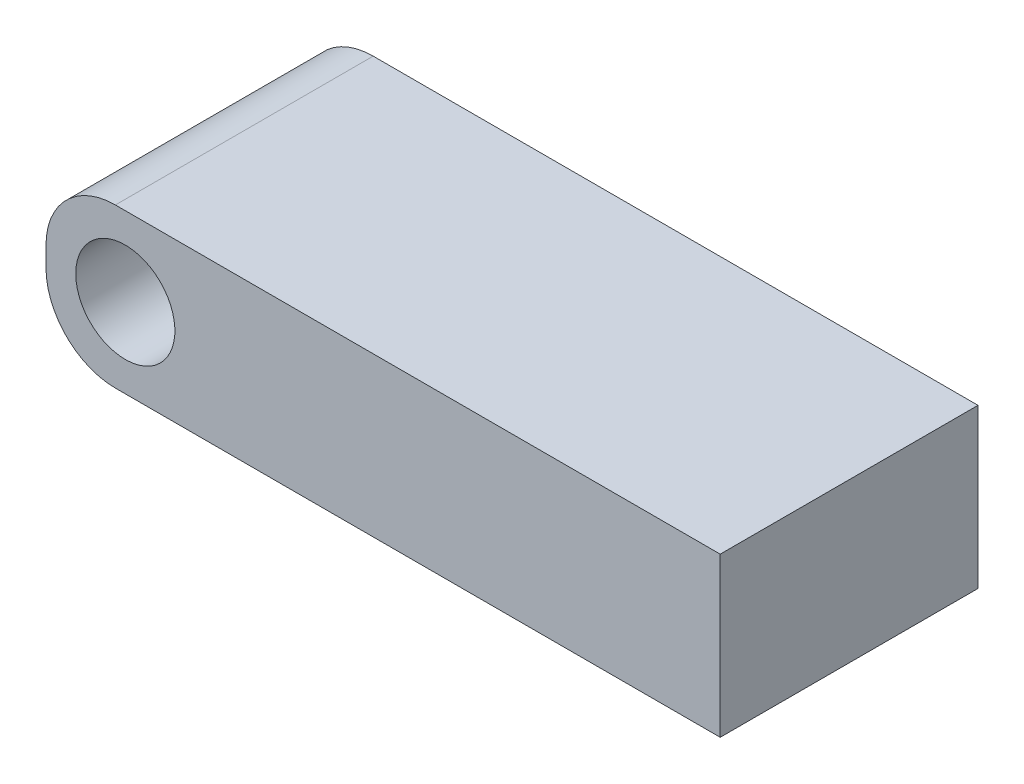
ISO-10303-21;
HEADER;
FILE_DESCRIPTION(('STEP AP214'),'2;1');
FILE_NAME('part.step','',(''),(''),'','','');
FILE_SCHEMA(('AUTOMOTIVE_DESIGN { 1 0 10303 214 1 1 1 1 }'));
ENDSEC;
DATA;
#1=APPLICATION_CONTEXT('core data for automotive mechanical design processes');
#2=APPLICATION_PROTOCOL_DEFINITION('international standard','automotive_design',2000,#1);
#3=PRODUCT_CONTEXT('',#1,'mechanical');
#4=PRODUCT('Part','Part','',(#3));
#5=PRODUCT_RELATED_PRODUCT_CATEGORY('part','',(#4));
#6=PRODUCT_DEFINITION_FORMATION('','',#4);
#7=PRODUCT_DEFINITION_CONTEXT('part definition',#1,'design');
#8=PRODUCT_DEFINITION('design','',#6,#7);
#9=PRODUCT_DEFINITION_SHAPE('','',#8);
#10=(LENGTH_UNIT() NAMED_UNIT(*) SI_UNIT(.MILLI.,.METRE.));
#11=(NAMED_UNIT(*) PLANE_ANGLE_UNIT() SI_UNIT($,.RADIAN.));
#12=(NAMED_UNIT(*) SI_UNIT($,.STERADIAN.) SOLID_ANGLE_UNIT());
#13=UNCERTAINTY_MEASURE_WITH_UNIT(LENGTH_MEASURE(1.E-05),#10,'distance_accuracy_value','');
#14=(GEOMETRIC_REPRESENTATION_CONTEXT(3) GLOBAL_UNCERTAINTY_ASSIGNED_CONTEXT((#13)) GLOBAL_UNIT_ASSIGNED_CONTEXT((#10,
#11,#12)) REPRESENTATION_CONTEXT('',''));
#15=CARTESIAN_POINT('',(0.,0.,0.));
#16=DIRECTION('',(0.,0.,1.));
#17=DIRECTION('',(1.,0.,0.));
#18=AXIS2_PLACEMENT_3D('',#15,#16,#17);
#19=CARTESIAN_POINT('',(-19.5,30.9286384577808,6.5));
#20=DIRECTION('',(0.,0.,-1.));
#21=DIRECTION('',(-1.,0.,0.));
#22=AXIS2_PLACEMENT_3D('',#19,#20,#21);
#23=PLANE('',#22);
#24=CARTESIAN_POINT('',(-19.5,30.9286384577808,6.5));
#25=DIRECTION('',(0.,0.,-1.));
#26=DIRECTION('',(-1.,0.,0.));
#27=AXIS2_PLACEMENT_3D('',#24,#25,#26);
#28=CIRCLE('',#27,3.5);
#29=CARTESIAN_POINT('',(-23.,30.9286384577807,6.5));
#30=VERTEX_POINT('',#29);
#31=CARTESIAN_POINT('',(-19.5,34.4286384577808,6.5));
#32=VERTEX_POINT('',#31);
#33=EDGE_CURVE('E165',#30,#32,#28,.T.);
#34=ORIENTED_EDGE('',*,*,#33,.F.);
#35=DIRECTION('',(0.,-1.,0.));
#36=VECTOR('',#35,1.);
#37=CARTESIAN_POINT('',(-23.,30.9286384577807,6.5));
#38=LINE('',#37,#36);
#39=CARTESIAN_POINT('',(-23.,29.9286384577808,6.5));
#40=VERTEX_POINT('',#39);
#41=EDGE_CURVE('E130',#30,#40,#38,.T.);
#42=ORIENTED_EDGE('',*,*,#41,.T.);
#43=CARTESIAN_POINT('',(-19.5,29.9286384577807,6.5));
#44=DIRECTION('',(0.,0.,1.));
#45=DIRECTION('',(1.,0.,0.));
#46=AXIS2_PLACEMENT_3D('',#43,#44,#45);
#47=CIRCLE('',#46,3.5);
#48=CARTESIAN_POINT('',(-19.5,26.4286384577808,6.5));
#49=VERTEX_POINT('',#48);
#50=EDGE_CURVE('E122',#40,#49,#47,.T.);
#51=ORIENTED_EDGE('',*,*,#50,.T.);
#52=DIRECTION('',(1.,0.,0.));
#53=VECTOR('',#52,1.);
#54=CARTESIAN_POINT('',(-19.5,26.4286384577808,6.5));
#55=LINE('',#54,#53);
#56=CARTESIAN_POINT('',(11.,26.4286384577808,6.5));
#57=VERTEX_POINT('',#56);
#58=EDGE_CURVE('E128',#49,#57,#55,.T.);
#59=ORIENTED_EDGE('',*,*,#58,.T.);
#60=DIRECTION('',(0.,-1.,0.));
#61=VECTOR('',#60,1.);
#62=CARTESIAN_POINT('',(11.,34.4286384577808,6.5));
#63=LINE('',#62,#61);
#64=CARTESIAN_POINT('',(11.,34.4286384577808,6.5));
#65=VERTEX_POINT('',#64);
#66=EDGE_CURVE('E145',#65,#57,#63,.T.);
#67=ORIENTED_EDGE('',*,*,#66,.F.);
#68=DIRECTION('',(1.,0.,0.));
#69=VECTOR('',#68,1.);
#70=CARTESIAN_POINT('',(-19.5,34.4286384577808,6.5));
#71=LINE('',#70,#69);
#72=EDGE_CURVE('E147',#32,#65,#71,.T.);
#73=ORIENTED_EDGE('',*,*,#72,.F.);
#74=EDGE_LOOP('',(#34,#42,#51,#59,#67,#73));
#75=FACE_BOUND('',#74,.T.);
#76=CARTESIAN_POINT('',(-19.,30.4286384577808,6.5));
#77=DIRECTION('',(0.,0.,1.));
#78=DIRECTION('',(1.,0.,0.));
#79=AXIS2_PLACEMENT_3D('',#76,#77,#78);
#80=CIRCLE('',#79,2.5);
#81=CARTESIAN_POINT('',(-21.5,30.4286384577808,6.5));
#82=VERTEX_POINT('',#81);
#83=EDGE_CURVE('E156',#82,#82,#80,.T.);
#84=ORIENTED_EDGE('',*,*,#83,.F.);
#85=EDGE_LOOP('',(#84));
#86=FACE_BOUND('',#85,.T.);
#87=ADVANCED_FACE('F64',(#75,#86),#23,.F.);
#88=CARTESIAN_POINT('',(-19.5,30.9286384577808,-6.5));
#89=DIRECTION('',(0.,0.,-1.));
#90=DIRECTION('',(-1.,0.,0.));
#91=AXIS2_PLACEMENT_3D('',#88,#89,#90);
#92=PLANE('',#91);
#93=CARTESIAN_POINT('',(-19.5,30.9286384577808,-6.5));
#94=DIRECTION('',(0.,0.,-1.));
#95=DIRECTION('',(-1.,0.,0.));
#96=AXIS2_PLACEMENT_3D('',#93,#94,#95);
#97=CIRCLE('',#96,3.5);
#98=CARTESIAN_POINT('',(-23.,30.9286384577807,-6.5));
#99=VERTEX_POINT('',#98);
#100=CARTESIAN_POINT('',(-19.5,34.4286384577808,-6.5));
#101=VERTEX_POINT('',#100);
#102=EDGE_CURVE('E152',#99,#101,#97,.T.);
#103=ORIENTED_EDGE('',*,*,#102,.T.);
#104=DIRECTION('',(1.,0.,0.));
#105=VECTOR('',#104,1.);
#106=CARTESIAN_POINT('',(-19.5,34.4286384577808,-6.5));
#107=LINE('',#106,#105);
#108=CARTESIAN_POINT('',(11.,34.4286384577808,-6.5));
#109=VERTEX_POINT('',#108);
#110=EDGE_CURVE('E155',#101,#109,#107,.T.);
#111=ORIENTED_EDGE('',*,*,#110,.T.);
#112=DIRECTION('',(0.,-1.,0.));
#113=VECTOR('',#112,1.);
#114=CARTESIAN_POINT('',(11.,34.4286384577808,-6.5));
#115=LINE('',#114,#113);
#116=CARTESIAN_POINT('',(11.,26.4286384577808,-6.5));
#117=VERTEX_POINT('',#116);
#118=EDGE_CURVE('E159',#109,#117,#115,.T.);
#119=ORIENTED_EDGE('',*,*,#118,.T.);
#120=DIRECTION('',(1.,0.,0.));
#121=VECTOR('',#120,1.);
#122=CARTESIAN_POINT('',(-19.5,26.4286384577808,-6.5));
#123=LINE('',#122,#121);
#124=CARTESIAN_POINT('',(-19.5,26.4286384577808,-6.5));
#125=VERTEX_POINT('',#124);
#126=EDGE_CURVE('E162',#125,#117,#123,.T.);
#127=ORIENTED_EDGE('',*,*,#126,.F.);
#128=CARTESIAN_POINT('',(-19.5,29.9286384577807,-6.5));
#129=DIRECTION('',(0.,0.,1.));
#130=DIRECTION('',(1.,0.,0.));
#131=AXIS2_PLACEMENT_3D('',#128,#129,#130);
#132=CIRCLE('',#131,3.5);
#133=CARTESIAN_POINT('',(-23.,29.9286384577808,-6.5));
#134=VERTEX_POINT('',#133);
#135=EDGE_CURVE('E137',#134,#125,#132,.T.);
#136=ORIENTED_EDGE('',*,*,#135,.F.);
#137=DIRECTION('',(0.,-1.,0.));
#138=VECTOR('',#137,1.);
#139=CARTESIAN_POINT('',(-23.,30.9286384577807,-6.5));
#140=LINE('',#139,#138);
#141=EDGE_CURVE('E104',#99,#134,#140,.T.);
#142=ORIENTED_EDGE('',*,*,#141,.F.);
#143=EDGE_LOOP('',(#103,#111,#119,#127,#136,#142));
#144=FACE_BOUND('',#143,.T.);
#145=CARTESIAN_POINT('',(-19.,30.4286384577808,-6.5));
#146=DIRECTION('',(0.,0.,1.));
#147=DIRECTION('',(1.,0.,0.));
#148=AXIS2_PLACEMENT_3D('',#145,#146,#147);
#149=CIRCLE('',#148,2.5);
#150=CARTESIAN_POINT('',(-21.5,30.4286384577808,-6.5));
#151=VERTEX_POINT('',#150);
#152=EDGE_CURVE('E178',#151,#151,#149,.T.);
#153=ORIENTED_EDGE('',*,*,#152,.T.);
#154=EDGE_LOOP('',(#153));
#155=FACE_BOUND('',#154,.T.);
#156=ADVANCED_FACE('F172',(#144,#155),#92,.T.);
#157=CARTESIAN_POINT('',(-19.5,30.9286384577808,6.5));
#158=DIRECTION('',(0.,0.,-1.));
#159=DIRECTION('',(-1.,0.,0.));
#160=AXIS2_PLACEMENT_3D('',#157,#158,#159);
#161=CYLINDRICAL_SURFACE('',#160,3.5);
#162=ORIENTED_EDGE('',*,*,#102,.F.);
#163=DIRECTION('',(0.,0.,-1.));
#164=VECTOR('',#163,1.);
#165=CARTESIAN_POINT('',(-23.,30.9286384577807,6.5));
#166=LINE('',#165,#164);
#167=EDGE_CURVE('E12',#30,#99,#166,.T.);
#168=ORIENTED_EDGE('',*,*,#167,.F.);
#169=ORIENTED_EDGE('',*,*,#33,.T.);
#170=DIRECTION('',(0.,0.,-1.));
#171=VECTOR('',#170,1.);
#172=CARTESIAN_POINT('',(-19.5,34.4286384577808,6.5));
#173=LINE('',#172,#171);
#174=EDGE_CURVE('E68',#32,#101,#173,.T.);
#175=ORIENTED_EDGE('',*,*,#174,.T.);
#176=EDGE_LOOP('',(#162,#168,#169,#175));
#177=FACE_BOUND('',#176,.T.);
#178=ADVANCED_FACE('F66',(#177),#161,.T.);
#179=CARTESIAN_POINT('',(-23.,30.9286384577807,6.5));
#180=DIRECTION('',(1.,0.,0.));
#181=DIRECTION('',(0.,0.,-1.));
#182=AXIS2_PLACEMENT_3D('',#179,#180,#181);
#183=PLANE('',#182);
#184=ORIENTED_EDGE('',*,*,#141,.T.);
#185=DIRECTION('',(0.,0.,-1.));
#186=VECTOR('',#185,1.);
#187=CARTESIAN_POINT('',(-23.,29.9286384577808,6.5));
#188=LINE('',#187,#186);
#189=EDGE_CURVE('E74',#40,#134,#188,.T.);
#190=ORIENTED_EDGE('',*,*,#189,.F.);
#191=ORIENTED_EDGE('',*,*,#41,.F.);
#192=ORIENTED_EDGE('',*,*,#167,.T.);
#193=EDGE_LOOP('',(#184,#190,#191,#192));
#194=FACE_BOUND('',#193,.T.);
#195=ADVANCED_FACE('F194',(#194),#183,.F.);
#196=CARTESIAN_POINT('',(-19.5,29.9286384577807,6.5));
#197=DIRECTION('',(0.,0.,-1.));
#198=DIRECTION('',(-1.,0.,0.));
#199=AXIS2_PLACEMENT_3D('',#196,#197,#198);
#200=CYLINDRICAL_SURFACE('',#199,3.5);
#201=ORIENTED_EDGE('',*,*,#135,.T.);
#202=DIRECTION('',(0.,0.,-1.));
#203=VECTOR('',#202,1.);
#204=CARTESIAN_POINT('',(-19.5,26.4286384577808,6.5));
#205=LINE('',#204,#203);
#206=EDGE_CURVE('E134',#49,#125,#205,.T.);
#207=ORIENTED_EDGE('',*,*,#206,.F.);
#208=ORIENTED_EDGE('',*,*,#50,.F.);
#209=ORIENTED_EDGE('',*,*,#189,.T.);
#210=EDGE_LOOP('',(#201,#207,#208,#209));
#211=FACE_BOUND('',#210,.T.);
#212=ADVANCED_FACE('F135',(#211),#200,.T.);
#213=CARTESIAN_POINT('',(-19.5,26.4286384577808,6.5));
#214=DIRECTION('',(0.,1.,0.));
#215=DIRECTION('',(0.,0.,1.));
#216=AXIS2_PLACEMENT_3D('',#213,#214,#215);
#217=PLANE('',#216);
#218=ORIENTED_EDGE('',*,*,#126,.T.);
#219=DIRECTION('',(0.,0.,-1.));
#220=VECTOR('',#219,1.);
#221=CARTESIAN_POINT('',(11.,26.4286384577808,6.5));
#222=LINE('',#221,#220);
#223=EDGE_CURVE('E141',#57,#117,#222,.T.);
#224=ORIENTED_EDGE('',*,*,#223,.F.);
#225=ORIENTED_EDGE('',*,*,#58,.F.);
#226=ORIENTED_EDGE('',*,*,#206,.T.);
#227=EDGE_LOOP('',(#218,#224,#225,#226));
#228=FACE_BOUND('',#227,.T.);
#229=ADVANCED_FACE('F143',(#228),#217,.F.);
#230=CARTESIAN_POINT('',(11.,34.4286384577808,6.5));
#231=DIRECTION('',(1.,0.,0.));
#232=DIRECTION('',(0.,1.,0.));
#233=AXIS2_PLACEMENT_3D('',#230,#231,#232);
#234=PLANE('',#233);
#235=ORIENTED_EDGE('',*,*,#118,.F.);
#236=DIRECTION('',(0.,0.,-1.));
#237=VECTOR('',#236,1.);
#238=CARTESIAN_POINT('',(11.,34.4286384577808,6.5));
#239=LINE('',#238,#237);
#240=EDGE_CURVE('E168',#65,#109,#239,.T.);
#241=ORIENTED_EDGE('',*,*,#240,.F.);
#242=ORIENTED_EDGE('',*,*,#66,.T.);
#243=ORIENTED_EDGE('',*,*,#223,.T.);
#244=EDGE_LOOP('',(#235,#241,#242,#243));
#245=FACE_BOUND('',#244,.T.);
#246=ADVANCED_FACE('F175',(#245),#234,.T.);
#247=CARTESIAN_POINT('',(-19.5,34.4286384577808,6.5));
#248=DIRECTION('',(0.,1.,0.));
#249=DIRECTION('',(0.,0.,1.));
#250=AXIS2_PLACEMENT_3D('',#247,#248,#249);
#251=PLANE('',#250);
#252=ORIENTED_EDGE('',*,*,#110,.F.);
#253=ORIENTED_EDGE('',*,*,#174,.F.);
#254=ORIENTED_EDGE('',*,*,#72,.T.);
#255=ORIENTED_EDGE('',*,*,#240,.T.);
#256=EDGE_LOOP('',(#252,#253,#254,#255));
#257=FACE_BOUND('',#256,.T.);
#258=ADVANCED_FACE('F170',(#257),#251,.T.);
#259=CARTESIAN_POINT('',(-19.,30.4286384577808,6.5));
#260=DIRECTION('',(0.,0.,-1.));
#261=DIRECTION('',(-1.,0.,0.));
#262=AXIS2_PLACEMENT_3D('',#259,#260,#261);
#263=CYLINDRICAL_SURFACE('',#262,2.5);
#264=CARTESIAN_POINT('',(-21.5,30.4286384577808,6.5));
#265=CARTESIAN_POINT('',(-21.5,30.4286384577808,6.36458333333333));
#266=CARTESIAN_POINT('',(-21.5,30.4286384577808,6.22916666666667));
#267=CARTESIAN_POINT('',(-21.5,30.4286384577808,5.95833333333333));
#268=CARTESIAN_POINT('',(-21.5,30.4286384577808,5.82291666666667));
#269=CARTESIAN_POINT('',(-21.5,30.4286384577808,5.55208333333333));
#270=CARTESIAN_POINT('',(-21.5,30.4286384577808,5.41666666666667));
#271=CARTESIAN_POINT('',(-21.5,30.4286384577808,5.14583333333333));
#272=CARTESIAN_POINT('',(-21.5,30.4286384577808,5.01041666666667));
#273=CARTESIAN_POINT('',(-21.5,30.4286384577808,4.73958333333333));
#274=CARTESIAN_POINT('',(-21.5,30.4286384577808,4.60416666666667));
#275=CARTESIAN_POINT('',(-21.5,30.4286384577808,4.33333333333333));
#276=CARTESIAN_POINT('',(-21.5,30.4286384577808,4.19791666666667));
#277=CARTESIAN_POINT('',(-21.5,30.4286384577808,3.92708333333333));
#278=CARTESIAN_POINT('',(-21.5,30.4286384577808,3.79166666666667));
#279=CARTESIAN_POINT('',(-21.5,30.4286384577808,3.52083333333333));
#280=CARTESIAN_POINT('',(-21.5,30.4286384577808,3.38541666666667));
#281=CARTESIAN_POINT('',(-21.5,30.4286384577808,3.11458333333333));
#282=CARTESIAN_POINT('',(-21.5,30.4286384577808,2.97916666666667));
#283=CARTESIAN_POINT('',(-21.5,30.4286384577808,2.70833333333333));
#284=CARTESIAN_POINT('',(-21.5,30.4286384577808,2.57291666666667));
#285=CARTESIAN_POINT('',(-21.5,30.4286384577808,2.30208333333333));
#286=CARTESIAN_POINT('',(-21.5,30.4286384577808,2.16666666666667));
#287=CARTESIAN_POINT('',(-21.5,30.4286384577808,1.89583333333333));
#288=CARTESIAN_POINT('',(-21.5,30.4286384577808,1.76041666666667));
#289=CARTESIAN_POINT('',(-21.5,30.4286384577808,1.48958333333333));
#290=CARTESIAN_POINT('',(-21.5,30.4286384577808,1.35416666666667));
#291=CARTESIAN_POINT('',(-21.5,30.4286384577808,1.08333333333333));
#292=CARTESIAN_POINT('',(-21.5,30.4286384577808,0.947916666666666));
#293=CARTESIAN_POINT('',(-21.5,30.4286384577808,0.677083333333332));
#294=CARTESIAN_POINT('',(-21.5,30.4286384577808,0.541666666666666));
#295=CARTESIAN_POINT('',(-21.5,30.4286384577808,0.270833333333333));
#296=CARTESIAN_POINT('',(-21.5,30.4286384577808,0.135416666666666));
#297=CARTESIAN_POINT('',(-21.5,30.4286384577808,-0.135416666666668));
#298=CARTESIAN_POINT('',(-21.5,30.4286384577808,-0.270833333333334));
#299=CARTESIAN_POINT('',(-21.5,30.4286384577808,-0.541666666666668));
#300=CARTESIAN_POINT('',(-21.5,30.4286384577808,-0.677083333333334));
#301=CARTESIAN_POINT('',(-21.5,30.4286384577808,-0.947916666666667));
#302=CARTESIAN_POINT('',(-21.5,30.4286384577808,-1.08333333333333));
#303=CARTESIAN_POINT('',(-21.5,30.4286384577808,-1.35416666666667));
#304=CARTESIAN_POINT('',(-21.5,30.4286384577808,-1.48958333333333));
#305=CARTESIAN_POINT('',(-21.5,30.4286384577808,-1.76041666666667));
#306=CARTESIAN_POINT('',(-21.5,30.4286384577808,-1.89583333333333));
#307=CARTESIAN_POINT('',(-21.5,30.4286384577808,-2.16666666666667));
#308=CARTESIAN_POINT('',(-21.5,30.4286384577808,-2.30208333333333));
#309=CARTESIAN_POINT('',(-21.5,30.4286384577808,-2.57291666666667));
#310=CARTESIAN_POINT('',(-21.5,30.4286384577808,-2.70833333333333));
#311=CARTESIAN_POINT('',(-21.5,30.4286384577808,-2.97916666666667));
#312=CARTESIAN_POINT('',(-21.5,30.4286384577808,-3.11458333333333));
#313=CARTESIAN_POINT('',(-21.5,30.4286384577808,-3.38541666666667));
#314=CARTESIAN_POINT('',(-21.5,30.4286384577808,-3.52083333333333));
#315=CARTESIAN_POINT('',(-21.5,30.4286384577808,-3.79166666666667));
#316=CARTESIAN_POINT('',(-21.5,30.4286384577808,-3.92708333333333));
#317=CARTESIAN_POINT('',(-21.5,30.4286384577808,-4.19791666666667));
#318=CARTESIAN_POINT('',(-21.5,30.4286384577808,-4.33333333333333));
#319=CARTESIAN_POINT('',(-21.5,30.4286384577808,-4.60416666666667));
#320=CARTESIAN_POINT('',(-21.5,30.4286384577808,-4.73958333333333));
#321=CARTESIAN_POINT('',(-21.5,30.4286384577808,-5.01041666666667));
#322=CARTESIAN_POINT('',(-21.5,30.4286384577808,-5.14583333333333));
#323=CARTESIAN_POINT('',(-21.5,30.4286384577808,-5.41666666666667));
#324=CARTESIAN_POINT('',(-21.5,30.4286384577808,-5.55208333333333));
#325=CARTESIAN_POINT('',(-21.5,30.4286384577808,-5.82291666666667));
#326=CARTESIAN_POINT('',(-21.5,30.4286384577808,-5.95833333333333));
#327=CARTESIAN_POINT('',(-21.5,30.4286384577808,-6.22916666666667));
#328=CARTESIAN_POINT('',(-21.5,30.4286384577808,-6.36458333333333));
#329=CARTESIAN_POINT('',(-21.5,30.4286384577808,-6.5));
#330=B_SPLINE_CURVE_WITH_KNOTS('',3,(#264,#265,#266,#267,#268,#269,#270,#271,#272,#273,#274,
#275,#276,#277,#278,#279,#280,#281,#282,#283,#284,#285,#286,#287,#288,#289,#290,#291,#292,#293,
#294,#295,#296,#297,#298,#299,#300,#301,#302,#303,#304,#305,#306,#307,#308,#309,#310,#311,#312,
#313,#314,#315,#316,#317,#318,#319,#320,#321,#322,#323,#324,#325,#326,#327,#328,#329),
.UNSPECIFIED.,.F.,.F.,(4,2,2,2,2,2,2,2,2,2,2,2,2,2,2,2,2,2,2,2,2,2,2,2,2,2,2,2,2,2,2,2,4),(0.,
0.40625,0.8125,1.21875,1.625,2.03125,2.4375,2.84375,3.25,3.65625,4.0625,4.46875,4.875,5.28125,
5.6875,6.09375,6.5,6.90625,7.3125,7.71875,8.125,8.53125,8.9375,9.34375,9.75,10.15625,10.5625,
10.96875,11.375,11.78125,12.1875,12.59375,13.),.UNSPECIFIED.);
#331=EDGE_CURVE('BSEAM184',#82,#151,#330,.T.);
#332=ORIENTED_EDGE('',*,*,#83,.T.);
#333=ORIENTED_EDGE('',*,*,#152,.F.);
#334=ORIENTED_EDGE('',*,*,#331,.T.);
#335=ORIENTED_EDGE('',*,*,#331,.F.);
#336=EDGE_LOOP('',(#332,#334,#333,#335));
#337=FACE_BOUND('',#336,.T.);
#338=ADVANCED_FACE('F184',(#337),#263,.F.);
#339=CLOSED_SHELL('',(#87,#156,#178,#195,#212,#229,#246,#258,#338));
#340=MANIFOLD_SOLID_BREP('B2',#339);
#341=ADVANCED_BREP_SHAPE_REPRESENTATION('',(#18,#340),#14);
#342=SHAPE_DEFINITION_REPRESENTATION(#9,#341);
ENDSEC;
END-ISO-10303-21;
